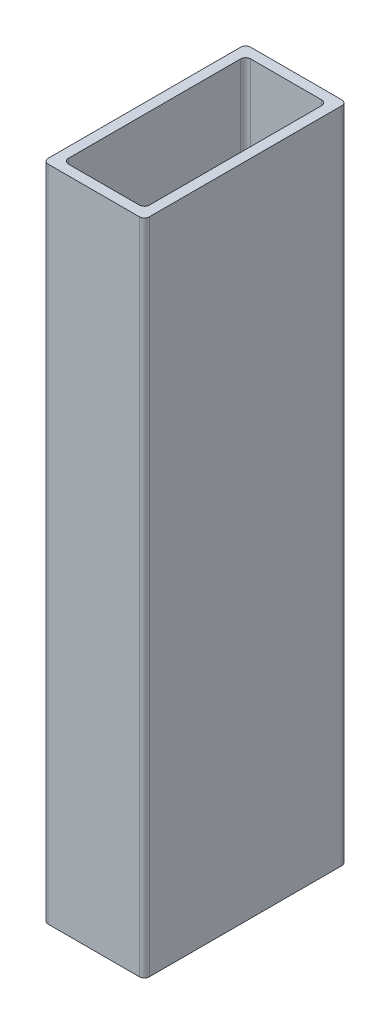
ISO-10303-21;
HEADER;
FILE_DESCRIPTION(('STEP AP214'),'2;1');
FILE_NAME('part.step','',(''),(''),'','','');
FILE_SCHEMA(('AUTOMOTIVE_DESIGN { 1 0 10303 214 1 1 1 1 }'));
ENDSEC;
DATA;
#1=APPLICATION_CONTEXT('core data for automotive mechanical design processes');
#2=APPLICATION_PROTOCOL_DEFINITION('international standard','automotive_design',2000,#1);
#3=PRODUCT_CONTEXT('',#1,'mechanical');
#4=PRODUCT('Part','Part','',(#3));
#5=PRODUCT_RELATED_PRODUCT_CATEGORY('part','',(#4));
#6=PRODUCT_DEFINITION_FORMATION('','',#4);
#7=PRODUCT_DEFINITION_CONTEXT('part definition',#1,'design');
#8=PRODUCT_DEFINITION('design','',#6,#7);
#9=PRODUCT_DEFINITION_SHAPE('','',#8);
#10=(LENGTH_UNIT() NAMED_UNIT(*) SI_UNIT(.MILLI.,.METRE.));
#11=(NAMED_UNIT(*) PLANE_ANGLE_UNIT() SI_UNIT($,.RADIAN.));
#12=(NAMED_UNIT(*) SI_UNIT($,.STERADIAN.) SOLID_ANGLE_UNIT());
#13=UNCERTAINTY_MEASURE_WITH_UNIT(LENGTH_MEASURE(1.E-05),#10,'distance_accuracy_value','');
#14=(GEOMETRIC_REPRESENTATION_CONTEXT(3) GLOBAL_UNCERTAINTY_ASSIGNED_CONTEXT((#13)) GLOBAL_UNIT_ASSIGNED_CONTEXT((#10,
#11,#12)) REPRESENTATION_CONTEXT('',''));
#15=CARTESIAN_POINT('',(0.,0.,0.));
#16=DIRECTION('',(0.,0.,1.));
#17=DIRECTION('',(1.,0.,0.));
#18=AXIS2_PLACEMENT_3D('',#15,#16,#17);
#19=CARTESIAN_POINT('',(2.,260.,-2.));
#20=DIRECTION('',(0.,-1.,0.));
#21=DIRECTION('',(0.,0.,-1.));
#22=AXIS2_PLACEMENT_3D('',#19,#20,#21);
#23=PLANE('',#22);
#24=CARTESIAN_POINT('',(2.,260.,-2.));
#25=DIRECTION('',(0.,1.,0.));
#26=DIRECTION('',(0.,0.,-1.));
#27=AXIS2_PLACEMENT_3D('',#24,#25,#26);
#28=CIRCLE('',#27,2.);
#29=CARTESIAN_POINT('',(0.,260.,-2.00000000000001));
#30=VERTEX_POINT('',#29);
#31=CARTESIAN_POINT('',(2.00000000000001,260.,0.));
#32=VERTEX_POINT('',#31);
#33=EDGE_CURVE('E211',#30,#32,#28,.T.);
#34=ORIENTED_EDGE('',*,*,#33,.T.);
#35=DIRECTION('',(1.,0.,0.));
#36=VECTOR('',#35,1.);
#37=CARTESIAN_POINT('',(2.00000000000001,260.,0.));
#38=LINE('',#37,#36);
#39=CARTESIAN_POINT('',(38.,260.,0.));
#40=VERTEX_POINT('',#39);
#41=EDGE_CURVE('E214',#32,#40,#38,.T.);
#42=ORIENTED_EDGE('',*,*,#41,.T.);
#43=CARTESIAN_POINT('',(38.,260.,-2.));
#44=DIRECTION('',(0.,1.,0.));
#45=DIRECTION('',(0.,0.,-1.));
#46=AXIS2_PLACEMENT_3D('',#43,#44,#45);
#47=CIRCLE('',#46,2.);
#48=CARTESIAN_POINT('',(40.,260.,-2.00000000000001));
#49=VERTEX_POINT('',#48);
#50=EDGE_CURVE('E217',#40,#49,#47,.T.);
#51=ORIENTED_EDGE('',*,*,#50,.T.);
#52=DIRECTION('',(0.,0.,-1.));
#53=VECTOR('',#52,1.);
#54=CARTESIAN_POINT('',(40.,260.,-2.00000000000001));
#55=LINE('',#54,#53);
#56=CARTESIAN_POINT('',(40.,260.,-78.));
#57=VERTEX_POINT('',#56);
#58=EDGE_CURVE('E219',#49,#57,#55,.T.);
#59=ORIENTED_EDGE('',*,*,#58,.T.);
#60=CARTESIAN_POINT('',(38.,260.,-78.));
#61=DIRECTION('',(0.,1.,0.));
#62=DIRECTION('',(0.,0.,-1.));
#63=AXIS2_PLACEMENT_3D('',#60,#61,#62);
#64=CIRCLE('',#63,2.);
#65=CARTESIAN_POINT('',(38.,260.,-80.));
#66=VERTEX_POINT('',#65);
#67=EDGE_CURVE('E221',#57,#66,#64,.T.);
#68=ORIENTED_EDGE('',*,*,#67,.T.);
#69=DIRECTION('',(-1.,0.,0.));
#70=VECTOR('',#69,1.);
#71=CARTESIAN_POINT('',(2.,260.,-80.));
#72=LINE('',#71,#70);
#73=CARTESIAN_POINT('',(2.,260.,-80.));
#74=VERTEX_POINT('',#73);
#75=EDGE_CURVE('E223',#66,#74,#72,.T.);
#76=ORIENTED_EDGE('',*,*,#75,.T.);
#77=CARTESIAN_POINT('',(2.,260.,-78.));
#78=DIRECTION('',(0.,1.,0.));
#79=DIRECTION('',(0.,0.,-1.));
#80=AXIS2_PLACEMENT_3D('',#77,#78,#79);
#81=CIRCLE('',#80,2.);
#82=CARTESIAN_POINT('',(0.,260.,-78.));
#83=VERTEX_POINT('',#82);
#84=EDGE_CURVE('E225',#74,#83,#81,.T.);
#85=ORIENTED_EDGE('',*,*,#84,.T.);
#86=DIRECTION('',(0.,0.,1.));
#87=VECTOR('',#86,1.);
#88=CARTESIAN_POINT('',(0.,260.,-2.00000000000001));
#89=LINE('',#88,#87);
#90=EDGE_CURVE('E227',#83,#30,#89,.T.);
#91=ORIENTED_EDGE('',*,*,#90,.T.);
#92=EDGE_LOOP('',(#34,#42,#51,#59,#68,#76,#85,#91));
#93=FACE_BOUND('',#92,.T.);
#94=CARTESIAN_POINT('',(34.,260.,-6.));
#95=DIRECTION('',(0.,1.,0.));
#96=DIRECTION('',(0.,0.,1.));
#97=AXIS2_PLACEMENT_3D('',#94,#95,#96);
#98=CIRCLE('',#97,2.);
#99=CARTESIAN_POINT('',(34.,260.,-4.));
#100=VERTEX_POINT('',#99);
#101=CARTESIAN_POINT('',(36.,260.,-6.00000000000001));
#102=VERTEX_POINT('',#101);
#103=EDGE_CURVE('E146',#100,#102,#98,.T.);
#104=ORIENTED_EDGE('',*,*,#103,.F.);
#105=DIRECTION('',(1.,0.,0.));
#106=VECTOR('',#105,1.);
#107=CARTESIAN_POINT('',(6.00000000000001,260.,-4.));
#108=LINE('',#107,#106);
#109=CARTESIAN_POINT('',(6.00000000000001,260.,-4.));
#110=VERTEX_POINT('',#109);
#111=EDGE_CURVE('E179',#110,#100,#108,.T.);
#112=ORIENTED_EDGE('',*,*,#111,.F.);
#113=CARTESIAN_POINT('',(6.,260.,-6.));
#114=DIRECTION('',(0.,1.,0.));
#115=DIRECTION('',(0.,0.,1.));
#116=AXIS2_PLACEMENT_3D('',#113,#114,#115);
#117=CIRCLE('',#116,2.);
#118=CARTESIAN_POINT('',(4.,260.,-6.00000000000002));
#119=VERTEX_POINT('',#118);
#120=EDGE_CURVE('E177',#119,#110,#117,.T.);
#121=ORIENTED_EDGE('',*,*,#120,.F.);
#122=DIRECTION('',(0.,0.,1.));
#123=VECTOR('',#122,1.);
#124=CARTESIAN_POINT('',(4.,260.,-6.00000000000001));
#125=LINE('',#124,#123);
#126=CARTESIAN_POINT('',(4.,260.,-74.));
#127=VERTEX_POINT('',#126);
#128=EDGE_CURVE('E175',#127,#119,#125,.T.);
#129=ORIENTED_EDGE('',*,*,#128,.F.);
#130=CARTESIAN_POINT('',(6.,260.,-74.));
#131=DIRECTION('',(0.,1.,0.));
#132=DIRECTION('',(0.,0.,1.));
#133=AXIS2_PLACEMENT_3D('',#130,#131,#132);
#134=CIRCLE('',#133,2.);
#135=CARTESIAN_POINT('',(6.,260.,-76.));
#136=VERTEX_POINT('',#135);
#137=EDGE_CURVE('E173',#136,#127,#134,.T.);
#138=ORIENTED_EDGE('',*,*,#137,.F.);
#139=DIRECTION('',(-1.,0.,0.));
#140=VECTOR('',#139,1.);
#141=CARTESIAN_POINT('',(6.,260.,-76.));
#142=LINE('',#141,#140);
#143=CARTESIAN_POINT('',(34.,260.,-76.));
#144=VERTEX_POINT('',#143);
#145=EDGE_CURVE('E169',#144,#136,#142,.T.);
#146=ORIENTED_EDGE('',*,*,#145,.F.);
#147=CARTESIAN_POINT('',(34.,260.,-74.));
#148=DIRECTION('',(0.,1.,0.));
#149=DIRECTION('',(0.,0.,1.));
#150=AXIS2_PLACEMENT_3D('',#147,#148,#149);
#151=CIRCLE('',#150,2.);
#152=CARTESIAN_POINT('',(36.,260.,-74.));
#153=VERTEX_POINT('',#152);
#154=EDGE_CURVE('E167',#153,#144,#151,.T.);
#155=ORIENTED_EDGE('',*,*,#154,.F.);
#156=DIRECTION('',(0.,0.,-1.));
#157=VECTOR('',#156,1.);
#158=CARTESIAN_POINT('',(36.,260.,-6.00000000000001));
#159=LINE('',#158,#157);
#160=EDGE_CURVE('E154',#102,#153,#159,.T.);
#161=ORIENTED_EDGE('',*,*,#160,.F.);
#162=EDGE_LOOP('',(#104,#112,#121,#129,#138,#146,#155,#161));
#163=FACE_BOUND('',#162,.T.);
#164=ADVANCED_FACE('F33',(#93,#163),#23,.F.);
#165=CARTESIAN_POINT('',(2.,0.,-2.));
#166=DIRECTION('',(0.,-1.,0.));
#167=DIRECTION('',(0.,0.,-1.));
#168=AXIS2_PLACEMENT_3D('',#165,#166,#167);
#169=PLANE('',#168);
#170=CARTESIAN_POINT('',(2.,0.,-2.));
#171=DIRECTION('',(0.,1.,0.));
#172=DIRECTION('',(0.,0.,-1.));
#173=AXIS2_PLACEMENT_3D('',#170,#171,#172);
#174=CIRCLE('',#173,2.);
#175=CARTESIAN_POINT('',(0.,0.,-2.00000000000001));
#176=VERTEX_POINT('',#175);
#177=CARTESIAN_POINT('',(2.00000000000001,0.,0.));
#178=VERTEX_POINT('',#177);
#179=EDGE_CURVE('E162',#176,#178,#174,.T.);
#180=ORIENTED_EDGE('',*,*,#179,.F.);
#181=DIRECTION('',(0.,0.,1.));
#182=VECTOR('',#181,1.);
#183=CARTESIAN_POINT('',(0.,0.,-2.00000000000001));
#184=LINE('',#183,#182);
#185=CARTESIAN_POINT('',(0.,0.,-78.));
#186=VERTEX_POINT('',#185);
#187=EDGE_CURVE('E215',#186,#176,#184,.T.);
#188=ORIENTED_EDGE('',*,*,#187,.F.);
#189=CARTESIAN_POINT('',(2.,0.,-78.));
#190=DIRECTION('',(0.,1.,0.));
#191=DIRECTION('',(0.,0.,-1.));
#192=AXIS2_PLACEMENT_3D('',#189,#190,#191);
#193=CIRCLE('',#192,2.);
#194=CARTESIAN_POINT('',(2.,0.,-80.));
#195=VERTEX_POINT('',#194);
#196=EDGE_CURVE('E242',#195,#186,#193,.T.);
#197=ORIENTED_EDGE('',*,*,#196,.F.);
#198=DIRECTION('',(-1.,0.,0.));
#199=VECTOR('',#198,1.);
#200=CARTESIAN_POINT('',(2.,0.,-80.));
#201=LINE('',#200,#199);
#202=CARTESIAN_POINT('',(38.,0.,-80.));
#203=VERTEX_POINT('',#202);
#204=EDGE_CURVE('E240',#203,#195,#201,.T.);
#205=ORIENTED_EDGE('',*,*,#204,.F.);
#206=CARTESIAN_POINT('',(38.,0.,-78.));
#207=DIRECTION('',(0.,1.,0.));
#208=DIRECTION('',(0.,0.,-1.));
#209=AXIS2_PLACEMENT_3D('',#206,#207,#208);
#210=CIRCLE('',#209,2.);
#211=CARTESIAN_POINT('',(40.,0.,-78.));
#212=VERTEX_POINT('',#211);
#213=EDGE_CURVE('E238',#212,#203,#210,.T.);
#214=ORIENTED_EDGE('',*,*,#213,.F.);
#215=DIRECTION('',(0.,0.,-1.));
#216=VECTOR('',#215,1.);
#217=CARTESIAN_POINT('',(40.,0.,-2.00000000000001));
#218=LINE('',#217,#216);
#219=CARTESIAN_POINT('',(40.,0.,-2.00000000000001));
#220=VERTEX_POINT('',#219);
#221=EDGE_CURVE('E236',#220,#212,#218,.T.);
#222=ORIENTED_EDGE('',*,*,#221,.F.);
#223=CARTESIAN_POINT('',(38.,0.,-2.));
#224=DIRECTION('',(0.,1.,0.));
#225=DIRECTION('',(0.,0.,-1.));
#226=AXIS2_PLACEMENT_3D('',#223,#224,#225);
#227=CIRCLE('',#226,2.);
#228=CARTESIAN_POINT('',(38.,0.,0.));
#229=VERTEX_POINT('',#228);
#230=EDGE_CURVE('E234',#229,#220,#227,.T.);
#231=ORIENTED_EDGE('',*,*,#230,.F.);
#232=DIRECTION('',(1.,0.,0.));
#233=VECTOR('',#232,1.);
#234=CARTESIAN_POINT('',(2.00000000000001,0.,0.));
#235=LINE('',#234,#233);
#236=EDGE_CURVE('E232',#178,#229,#235,.T.);
#237=ORIENTED_EDGE('',*,*,#236,.F.);
#238=EDGE_LOOP('',(#180,#188,#197,#205,#214,#222,#231,#237));
#239=FACE_BOUND('',#238,.T.);
#240=DIRECTION('',(1.,0.,0.));
#241=VECTOR('',#240,1.);
#242=CARTESIAN_POINT('',(6.00000000000001,0.,-4.));
#243=LINE('',#242,#241);
#244=CARTESIAN_POINT('',(6.00000000000001,0.,-4.));
#245=VERTEX_POINT('',#244);
#246=CARTESIAN_POINT('',(34.,0.,-4.));
#247=VERTEX_POINT('',#246);
#248=EDGE_CURVE('E155',#245,#247,#243,.T.);
#249=ORIENTED_EDGE('',*,*,#248,.T.);
#250=CARTESIAN_POINT('',(34.,0.,-6.));
#251=DIRECTION('',(0.,1.,0.));
#252=DIRECTION('',(0.,0.,1.));
#253=AXIS2_PLACEMENT_3D('',#250,#251,#252);
#254=CIRCLE('',#253,2.);
#255=CARTESIAN_POINT('',(36.,0.,-6.00000000000001));
#256=VERTEX_POINT('',#255);
#257=EDGE_CURVE('E56',#247,#256,#254,.T.);
#258=ORIENTED_EDGE('',*,*,#257,.T.);
#259=DIRECTION('',(0.,0.,-1.));
#260=VECTOR('',#259,1.);
#261=CARTESIAN_POINT('',(36.,0.,-6.00000000000001));
#262=LINE('',#261,#260);
#263=CARTESIAN_POINT('',(36.,0.,-74.));
#264=VERTEX_POINT('',#263);
#265=EDGE_CURVE('E161',#256,#264,#262,.T.);
#266=ORIENTED_EDGE('',*,*,#265,.T.);
#267=CARTESIAN_POINT('',(34.,0.,-74.));
#268=DIRECTION('',(0.,1.,0.));
#269=DIRECTION('',(0.,0.,1.));
#270=AXIS2_PLACEMENT_3D('',#267,#268,#269);
#271=CIRCLE('',#270,2.);
#272=CARTESIAN_POINT('',(34.,0.,-76.));
#273=VERTEX_POINT('',#272);
#274=EDGE_CURVE('E183',#264,#273,#271,.T.);
#275=ORIENTED_EDGE('',*,*,#274,.T.);
#276=DIRECTION('',(-1.,0.,0.));
#277=VECTOR('',#276,1.);
#278=CARTESIAN_POINT('',(6.,0.,-76.));
#279=LINE('',#278,#277);
#280=CARTESIAN_POINT('',(6.,0.,-76.));
#281=VERTEX_POINT('',#280);
#282=EDGE_CURVE('E186',#273,#281,#279,.T.);
#283=ORIENTED_EDGE('',*,*,#282,.T.);
#284=CARTESIAN_POINT('',(6.,0.,-74.));
#285=DIRECTION('',(0.,1.,0.));
#286=DIRECTION('',(0.,0.,1.));
#287=AXIS2_PLACEMENT_3D('',#284,#285,#286);
#288=CIRCLE('',#287,2.);
#289=CARTESIAN_POINT('',(4.,0.,-74.));
#290=VERTEX_POINT('',#289);
#291=EDGE_CURVE('E189',#281,#290,#288,.T.);
#292=ORIENTED_EDGE('',*,*,#291,.T.);
#293=DIRECTION('',(0.,0.,1.));
#294=VECTOR('',#293,1.);
#295=CARTESIAN_POINT('',(4.,0.,-6.00000000000001));
#296=LINE('',#295,#294);
#297=CARTESIAN_POINT('',(4.,0.,-6.00000000000002));
#298=VERTEX_POINT('',#297);
#299=EDGE_CURVE('E192',#290,#298,#296,.T.);
#300=ORIENTED_EDGE('',*,*,#299,.T.);
#301=CARTESIAN_POINT('',(6.,0.,-6.));
#302=DIRECTION('',(0.,1.,0.));
#303=DIRECTION('',(0.,0.,1.));
#304=AXIS2_PLACEMENT_3D('',#301,#302,#303);
#305=CIRCLE('',#304,2.);
#306=EDGE_CURVE('E195',#298,#245,#305,.T.);
#307=ORIENTED_EDGE('',*,*,#306,.T.);
#308=EDGE_LOOP('',(#249,#258,#266,#275,#283,#292,#300,#307));
#309=FACE_BOUND('',#308,.T.);
#310=ADVANCED_FACE('F272',(#239,#309),#169,.T.);
#311=CARTESIAN_POINT('',(2.,260.,-2.));
#312=DIRECTION('',(0.,-1.,0.));
#313=DIRECTION('',(0.,0.,-1.));
#314=AXIS2_PLACEMENT_3D('',#311,#312,#313);
#315=CYLINDRICAL_SURFACE('',#314,2.);
#316=ORIENTED_EDGE('',*,*,#179,.T.);
#317=DIRECTION('',(0.,-1.,0.));
#318=VECTOR('',#317,1.);
#319=CARTESIAN_POINT('',(2.00000000000001,260.,0.));
#320=LINE('',#319,#318);
#321=EDGE_CURVE('E11',#32,#178,#320,.T.);
#322=ORIENTED_EDGE('',*,*,#321,.F.);
#323=ORIENTED_EDGE('',*,*,#33,.F.);
#324=DIRECTION('',(0.,-1.,0.));
#325=VECTOR('',#324,1.);
#326=CARTESIAN_POINT('',(0.,260.,-2.00000000000001));
#327=LINE('',#326,#325);
#328=EDGE_CURVE('E229',#30,#176,#327,.T.);
#329=ORIENTED_EDGE('',*,*,#328,.T.);
#330=EDGE_LOOP('',(#316,#322,#323,#329));
#331=FACE_BOUND('',#330,.T.);
#332=ADVANCED_FACE('F35',(#331),#315,.T.);
#333=CARTESIAN_POINT('',(2.00000000000001,260.,0.));
#334=DIRECTION('',(0.,0.,-1.));
#335=DIRECTION('',(-1.,0.,0.));
#336=AXIS2_PLACEMENT_3D('',#333,#334,#335);
#337=PLANE('',#336);
#338=ORIENTED_EDGE('',*,*,#236,.T.);
#339=DIRECTION('',(0.,-1.,0.));
#340=VECTOR('',#339,1.);
#341=CARTESIAN_POINT('',(38.,260.,0.));
#342=LINE('',#341,#340);
#343=EDGE_CURVE('E41',#40,#229,#342,.T.);
#344=ORIENTED_EDGE('',*,*,#343,.F.);
#345=ORIENTED_EDGE('',*,*,#41,.F.);
#346=ORIENTED_EDGE('',*,*,#321,.T.);
#347=EDGE_LOOP('',(#338,#344,#345,#346));
#348=FACE_BOUND('',#347,.T.);
#349=ADVANCED_FACE('F289',(#348),#337,.F.);
#350=CARTESIAN_POINT('',(38.,260.,-2.));
#351=DIRECTION('',(0.,-1.,0.));
#352=DIRECTION('',(0.,0.,-1.));
#353=AXIS2_PLACEMENT_3D('',#350,#351,#352);
#354=CYLINDRICAL_SURFACE('',#353,2.);
#355=ORIENTED_EDGE('',*,*,#230,.T.);
#356=DIRECTION('',(0.,-1.,0.));
#357=VECTOR('',#356,1.);
#358=CARTESIAN_POINT('',(40.,260.,-2.00000000000001));
#359=LINE('',#358,#357);
#360=EDGE_CURVE('E259',#49,#220,#359,.T.);
#361=ORIENTED_EDGE('',*,*,#360,.F.);
#362=ORIENTED_EDGE('',*,*,#50,.F.);
#363=ORIENTED_EDGE('',*,*,#343,.T.);
#364=EDGE_LOOP('',(#355,#361,#362,#363));
#365=FACE_BOUND('',#364,.T.);
#366=ADVANCED_FACE('F266',(#365),#354,.T.);
#367=CARTESIAN_POINT('',(40.,260.,-2.00000000000001));
#368=DIRECTION('',(-1.,0.,0.));
#369=DIRECTION('',(0.,0.,1.));
#370=AXIS2_PLACEMENT_3D('',#367,#368,#369);
#371=PLANE('',#370);
#372=ORIENTED_EDGE('',*,*,#221,.T.);
#373=DIRECTION('',(0.,-1.,0.));
#374=VECTOR('',#373,1.);
#375=CARTESIAN_POINT('',(40.,260.,-78.));
#376=LINE('',#375,#374);
#377=EDGE_CURVE('E256',#57,#212,#376,.T.);
#378=ORIENTED_EDGE('',*,*,#377,.F.);
#379=ORIENTED_EDGE('',*,*,#58,.F.);
#380=ORIENTED_EDGE('',*,*,#360,.T.);
#381=EDGE_LOOP('',(#372,#378,#379,#380));
#382=FACE_BOUND('',#381,.T.);
#383=ADVANCED_FACE('F278',(#382),#371,.F.);
#384=CARTESIAN_POINT('',(38.,260.,-78.));
#385=DIRECTION('',(0.,-1.,0.));
#386=DIRECTION('',(0.,0.,-1.));
#387=AXIS2_PLACEMENT_3D('',#384,#385,#386);
#388=CYLINDRICAL_SURFACE('',#387,2.);
#389=ORIENTED_EDGE('',*,*,#213,.T.);
#390=DIRECTION('',(0.,-1.,0.));
#391=VECTOR('',#390,1.);
#392=CARTESIAN_POINT('',(38.,260.,-80.));
#393=LINE('',#392,#391);
#394=EDGE_CURVE('E253',#66,#203,#393,.T.);
#395=ORIENTED_EDGE('',*,*,#394,.F.);
#396=ORIENTED_EDGE('',*,*,#67,.F.);
#397=ORIENTED_EDGE('',*,*,#377,.T.);
#398=EDGE_LOOP('',(#389,#395,#396,#397));
#399=FACE_BOUND('',#398,.T.);
#400=ADVANCED_FACE('F282',(#399),#388,.T.);
#401=CARTESIAN_POINT('',(2.,260.,-80.));
#402=DIRECTION('',(0.,0.,1.));
#403=DIRECTION('',(1.,0.,0.));
#404=AXIS2_PLACEMENT_3D('',#401,#402,#403);
#405=PLANE('',#404);
#406=ORIENTED_EDGE('',*,*,#204,.T.);
#407=DIRECTION('',(0.,-1.,0.));
#408=VECTOR('',#407,1.);
#409=CARTESIAN_POINT('',(2.,260.,-80.));
#410=LINE('',#409,#408);
#411=EDGE_CURVE('E250',#74,#195,#410,.T.);
#412=ORIENTED_EDGE('',*,*,#411,.F.);
#413=ORIENTED_EDGE('',*,*,#75,.F.);
#414=ORIENTED_EDGE('',*,*,#394,.T.);
#415=EDGE_LOOP('',(#406,#412,#413,#414));
#416=FACE_BOUND('',#415,.T.);
#417=ADVANCED_FACE('F302',(#416),#405,.F.);
#418=CARTESIAN_POINT('',(2.,260.,-78.));
#419=DIRECTION('',(0.,-1.,0.));
#420=DIRECTION('',(0.,0.,-1.));
#421=AXIS2_PLACEMENT_3D('',#418,#419,#420);
#422=CYLINDRICAL_SURFACE('',#421,2.);
#423=ORIENTED_EDGE('',*,*,#196,.T.);
#424=DIRECTION('',(0.,-1.,0.));
#425=VECTOR('',#424,1.);
#426=CARTESIAN_POINT('',(0.,260.,-78.));
#427=LINE('',#426,#425);
#428=EDGE_CURVE('E247',#83,#186,#427,.T.);
#429=ORIENTED_EDGE('',*,*,#428,.F.);
#430=ORIENTED_EDGE('',*,*,#84,.F.);
#431=ORIENTED_EDGE('',*,*,#411,.T.);
#432=EDGE_LOOP('',(#423,#429,#430,#431));
#433=FACE_BOUND('',#432,.T.);
#434=ADVANCED_FACE('F300',(#433),#422,.T.);
#435=CARTESIAN_POINT('',(0.,260.,-2.00000000000001));
#436=DIRECTION('',(1.,0.,0.));
#437=DIRECTION('',(0.,0.,-1.));
#438=AXIS2_PLACEMENT_3D('',#435,#436,#437);
#439=PLANE('',#438);
#440=ORIENTED_EDGE('',*,*,#187,.T.);
#441=ORIENTED_EDGE('',*,*,#328,.F.);
#442=ORIENTED_EDGE('',*,*,#90,.F.);
#443=ORIENTED_EDGE('',*,*,#428,.T.);
#444=EDGE_LOOP('',(#440,#441,#442,#443));
#445=FACE_BOUND('',#444,.T.);
#446=ADVANCED_FACE('F295',(#445),#439,.F.);
#447=CARTESIAN_POINT('',(34.,260.,-6.));
#448=DIRECTION('',(0.,-1.,0.));
#449=DIRECTION('',(0.,0.,-1.));
#450=AXIS2_PLACEMENT_3D('',#447,#448,#449);
#451=CYLINDRICAL_SURFACE('',#450,2.);
#452=ORIENTED_EDGE('',*,*,#257,.F.);
#453=DIRECTION('',(0.,-1.,0.));
#454=VECTOR('',#453,1.);
#455=CARTESIAN_POINT('',(34.,260.,-4.));
#456=LINE('',#455,#454);
#457=EDGE_CURVE('E150',#100,#247,#456,.T.);
#458=ORIENTED_EDGE('',*,*,#457,.F.);
#459=ORIENTED_EDGE('',*,*,#103,.T.);
#460=DIRECTION('',(0.,-1.,0.));
#461=VECTOR('',#460,1.);
#462=CARTESIAN_POINT('',(36.,260.,-6.00000000000001));
#463=LINE('',#462,#461);
#464=EDGE_CURVE('E149',#102,#256,#463,.T.);
#465=ORIENTED_EDGE('',*,*,#464,.T.);
#466=EDGE_LOOP('',(#452,#458,#459,#465));
#467=FACE_BOUND('',#466,.T.);
#468=ADVANCED_FACE('F148',(#467),#451,.F.);
#469=CARTESIAN_POINT('',(36.,260.,-6.00000000000001));
#470=DIRECTION('',(-1.,0.,0.));
#471=DIRECTION('',(0.,0.,1.));
#472=AXIS2_PLACEMENT_3D('',#469,#470,#471);
#473=PLANE('',#472);
#474=ORIENTED_EDGE('',*,*,#265,.F.);
#475=ORIENTED_EDGE('',*,*,#464,.F.);
#476=ORIENTED_EDGE('',*,*,#160,.T.);
#477=DIRECTION('',(0.,-1.,0.));
#478=VECTOR('',#477,1.);
#479=CARTESIAN_POINT('',(36.,260.,-74.));
#480=LINE('',#479,#478);
#481=EDGE_CURVE('E163',#153,#264,#480,.T.);
#482=ORIENTED_EDGE('',*,*,#481,.T.);
#483=EDGE_LOOP('',(#474,#475,#476,#482));
#484=FACE_BOUND('',#483,.T.);
#485=ADVANCED_FACE('F158',(#484),#473,.T.);
#486=CARTESIAN_POINT('',(34.,260.,-74.));
#487=DIRECTION('',(0.,-1.,0.));
#488=DIRECTION('',(0.,0.,-1.));
#489=AXIS2_PLACEMENT_3D('',#486,#487,#488);
#490=CYLINDRICAL_SURFACE('',#489,2.);
#491=ORIENTED_EDGE('',*,*,#274,.F.);
#492=ORIENTED_EDGE('',*,*,#481,.F.);
#493=ORIENTED_EDGE('',*,*,#154,.T.);
#494=DIRECTION('',(0.,-1.,0.));
#495=VECTOR('',#494,1.);
#496=CARTESIAN_POINT('',(34.,260.,-76.));
#497=LINE('',#496,#495);
#498=EDGE_CURVE('E208',#144,#273,#497,.T.);
#499=ORIENTED_EDGE('',*,*,#498,.T.);
#500=EDGE_LOOP('',(#491,#492,#493,#499));
#501=FACE_BOUND('',#500,.T.);
#502=ADVANCED_FACE('F327',(#501),#490,.F.);
#503=CARTESIAN_POINT('',(6.,260.,-76.));
#504=DIRECTION('',(0.,0.,1.));
#505=DIRECTION('',(1.,0.,0.));
#506=AXIS2_PLACEMENT_3D('',#503,#504,#505);
#507=PLANE('',#506);
#508=ORIENTED_EDGE('',*,*,#282,.F.);
#509=ORIENTED_EDGE('',*,*,#498,.F.);
#510=ORIENTED_EDGE('',*,*,#145,.T.);
#511=DIRECTION('',(0.,-1.,0.));
#512=VECTOR('',#511,1.);
#513=CARTESIAN_POINT('',(6.,260.,-76.));
#514=LINE('',#513,#512);
#515=EDGE_CURVE('E206',#136,#281,#514,.T.);
#516=ORIENTED_EDGE('',*,*,#515,.T.);
#517=EDGE_LOOP('',(#508,#509,#510,#516));
#518=FACE_BOUND('',#517,.T.);
#519=ADVANCED_FACE('F331',(#518),#507,.T.);
#520=CARTESIAN_POINT('',(6.,260.,-74.));
#521=DIRECTION('',(0.,-1.,0.));
#522=DIRECTION('',(0.,0.,-1.));
#523=AXIS2_PLACEMENT_3D('',#520,#521,#522);
#524=CYLINDRICAL_SURFACE('',#523,2.);
#525=ORIENTED_EDGE('',*,*,#291,.F.);
#526=ORIENTED_EDGE('',*,*,#515,.F.);
#527=ORIENTED_EDGE('',*,*,#137,.T.);
#528=DIRECTION('',(0.,-1.,0.));
#529=VECTOR('',#528,1.);
#530=CARTESIAN_POINT('',(4.,260.,-74.));
#531=LINE('',#530,#529);
#532=EDGE_CURVE('E204',#127,#290,#531,.T.);
#533=ORIENTED_EDGE('',*,*,#532,.T.);
#534=EDGE_LOOP('',(#525,#526,#527,#533));
#535=FACE_BOUND('',#534,.T.);
#536=ADVANCED_FACE('F337',(#535),#524,.F.);
#537=CARTESIAN_POINT('',(4.,260.,-6.00000000000001));
#538=DIRECTION('',(1.,0.,0.));
#539=DIRECTION('',(0.,0.,-1.));
#540=AXIS2_PLACEMENT_3D('',#537,#538,#539);
#541=PLANE('',#540);
#542=ORIENTED_EDGE('',*,*,#299,.F.);
#543=ORIENTED_EDGE('',*,*,#532,.F.);
#544=ORIENTED_EDGE('',*,*,#128,.T.);
#545=DIRECTION('',(0.,-1.,0.));
#546=VECTOR('',#545,1.);
#547=CARTESIAN_POINT('',(4.,260.,-6.00000000000002));
#548=LINE('',#547,#546);
#549=EDGE_CURVE('E202',#119,#298,#548,.T.);
#550=ORIENTED_EDGE('',*,*,#549,.T.);
#551=EDGE_LOOP('',(#542,#543,#544,#550));
#552=FACE_BOUND('',#551,.T.);
#553=ADVANCED_FACE('F341',(#552),#541,.T.);
#554=CARTESIAN_POINT('',(6.,260.,-6.));
#555=DIRECTION('',(0.,-1.,0.));
#556=DIRECTION('',(0.,0.,-1.));
#557=AXIS2_PLACEMENT_3D('',#554,#555,#556);
#558=CYLINDRICAL_SURFACE('',#557,2.);
#559=ORIENTED_EDGE('',*,*,#306,.F.);
#560=ORIENTED_EDGE('',*,*,#549,.F.);
#561=ORIENTED_EDGE('',*,*,#120,.T.);
#562=DIRECTION('',(0.,-1.,0.));
#563=VECTOR('',#562,1.);
#564=CARTESIAN_POINT('',(6.00000000000001,260.,-4.));
#565=LINE('',#564,#563);
#566=EDGE_CURVE('E48',#110,#245,#565,.T.);
#567=ORIENTED_EDGE('',*,*,#566,.T.);
#568=EDGE_LOOP('',(#559,#560,#561,#567));
#569=FACE_BOUND('',#568,.T.);
#570=ADVANCED_FACE('F345',(#569),#558,.F.);
#571=CARTESIAN_POINT('',(6.00000000000001,260.,-4.));
#572=DIRECTION('',(0.,0.,-1.));
#573=DIRECTION('',(-1.,0.,0.));
#574=AXIS2_PLACEMENT_3D('',#571,#572,#573);
#575=PLANE('',#574);
#576=ORIENTED_EDGE('',*,*,#248,.F.);
#577=ORIENTED_EDGE('',*,*,#566,.F.);
#578=ORIENTED_EDGE('',*,*,#111,.T.);
#579=ORIENTED_EDGE('',*,*,#457,.T.);
#580=EDGE_LOOP('',(#576,#577,#578,#579));
#581=FACE_BOUND('',#580,.T.);
#582=ADVANCED_FACE('F349',(#581),#575,.T.);
#583=CLOSED_SHELL('',(#164,#310,#332,#349,#366,#383,#400,#417,#434,#446,#468,#485,#502,#519,
#536,#553,#570,#582));
#584=MANIFOLD_SOLID_BREP('B2',#583);
#585=ADVANCED_BREP_SHAPE_REPRESENTATION('',(#18,#584),#14);
#586=SHAPE_DEFINITION_REPRESENTATION(#9,#585);
ENDSEC;
END-ISO-10303-21;
